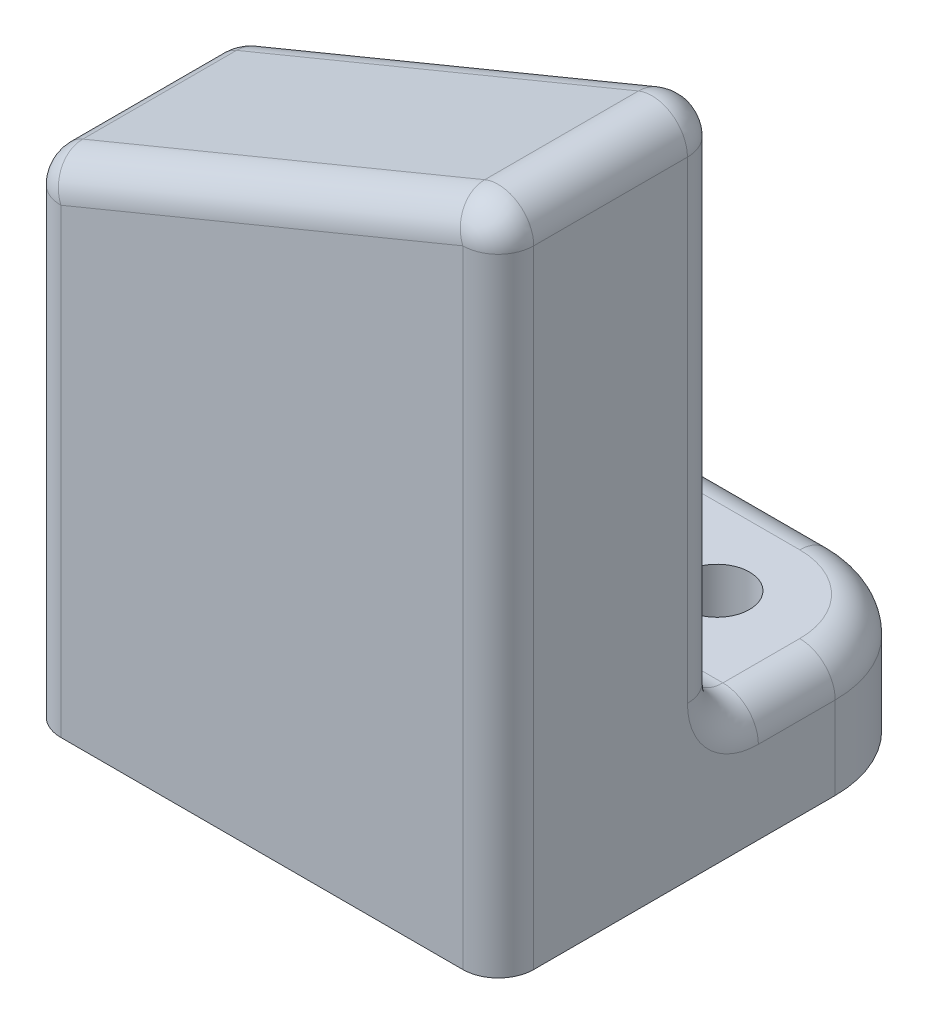
ISO-10303-21;
HEADER;
FILE_DESCRIPTION(('STEP AP214'),'2;1');
FILE_NAME('part.step','',(''),(''),'','','');
FILE_SCHEMA(('AUTOMOTIVE_DESIGN { 1 0 10303 214 1 1 1 1 }'));
ENDSEC;
DATA;
#1=APPLICATION_CONTEXT('core data for automotive mechanical design processes');
#2=APPLICATION_PROTOCOL_DEFINITION('international standard','automotive_design',2000,#1);
#3=PRODUCT_CONTEXT('',#1,'mechanical');
#4=PRODUCT('Part','Part','',(#3));
#5=PRODUCT_RELATED_PRODUCT_CATEGORY('part','',(#4));
#6=PRODUCT_DEFINITION_FORMATION('','',#4);
#7=PRODUCT_DEFINITION_CONTEXT('part definition',#1,'design');
#8=PRODUCT_DEFINITION('design','',#6,#7);
#9=PRODUCT_DEFINITION_SHAPE('','',#8);
#10=(LENGTH_UNIT() NAMED_UNIT(*) SI_UNIT(.MILLI.,.METRE.));
#11=(NAMED_UNIT(*) PLANE_ANGLE_UNIT() SI_UNIT($,.RADIAN.));
#12=(NAMED_UNIT(*) SI_UNIT($,.STERADIAN.) SOLID_ANGLE_UNIT());
#13=UNCERTAINTY_MEASURE_WITH_UNIT(LENGTH_MEASURE(1.E-05),#10,'distance_accuracy_value','');
#14=(GEOMETRIC_REPRESENTATION_CONTEXT(3) GLOBAL_UNCERTAINTY_ASSIGNED_CONTEXT((#13)) GLOBAL_UNIT_ASSIGNED_CONTEXT((#10,
#11,#12)) REPRESENTATION_CONTEXT('',''));
#15=CARTESIAN_POINT('',(0.,0.,0.));
#16=DIRECTION('',(0.,0.,1.));
#17=DIRECTION('',(1.,0.,0.));
#18=AXIS2_PLACEMENT_3D('',#15,#16,#17);
#19=CARTESIAN_POINT('',(20.,0.,-38.));
#20=DIRECTION('',(0.,1.,0.));
#21=DIRECTION('',(0.,0.,-1.));
#22=AXIS2_PLACEMENT_3D('',#19,#20,#21);
#23=PLANE('',#22);
#24=CARTESIAN_POINT('',(-10.,0.,-28.5));
#25=DIRECTION('',(0.,-1.,0.));
#26=DIRECTION('',(0.,0.,-1.));
#27=AXIS2_PLACEMENT_3D('',#24,#25,#26);
#28=CIRCLE('',#27,2.75);
#29=CARTESIAN_POINT('',(-10.,0.,-31.25));
#30=VERTEX_POINT('',#29);
#31=EDGE_CURVE('E683',#30,#30,#28,.T.);
#32=ORIENTED_EDGE('',*,*,#31,.F.);
#33=EDGE_LOOP('',(#32));
#34=FACE_BOUND('',#33,.T.);
#35=CARTESIAN_POINT('',(10.,0.,-28.5));
#36=DIRECTION('',(0.,-1.,0.));
#37=DIRECTION('',(0.,0.,-1.));
#38=AXIS2_PLACEMENT_3D('',#35,#36,#37);
#39=CIRCLE('',#38,2.75);
#40=CARTESIAN_POINT('',(10.,0.,-31.25));
#41=VERTEX_POINT('',#40);
#42=EDGE_CURVE('E338',#41,#41,#39,.T.);
#43=ORIENTED_EDGE('',*,*,#42,.F.);
#44=EDGE_LOOP('',(#43));
#45=FACE_BOUND('',#44,.T.);
#46=DIRECTION('',(0.,0.,1.));
#47=VECTOR('',#46,1.);
#48=CARTESIAN_POINT('',(-20.,0.,-38.));
#49=LINE('',#48,#47);
#50=CARTESIAN_POINT('',(-20.,0.,-28.5));
#51=VERTEX_POINT('',#50);
#52=CARTESIAN_POINT('',(-20.,0.,-3.));
#53=VERTEX_POINT('',#52);
#54=EDGE_CURVE('E197',#51,#53,#49,.T.);
#55=ORIENTED_EDGE('',*,*,#54,.F.);
#56=CARTESIAN_POINT('',(-10.5,0.,-28.5));
#57=DIRECTION('',(0.,-1.,0.));
#58=DIRECTION('',(0.,0.,-1.));
#59=AXIS2_PLACEMENT_3D('',#56,#57,#58);
#60=CIRCLE('',#59,9.5);
#61=CARTESIAN_POINT('',(-10.5,0.,-38.));
#62=VERTEX_POINT('',#61);
#63=EDGE_CURVE('E189',#62,#51,#60,.F.);
#64=ORIENTED_EDGE('',*,*,#63,.F.);
#65=DIRECTION('',(-1.,0.,0.));
#66=VECTOR('',#65,1.);
#67=CARTESIAN_POINT('',(20.,0.,-38.));
#68=LINE('',#67,#66);
#69=CARTESIAN_POINT('',(10.5,0.,-38.));
#70=VERTEX_POINT('',#69);
#71=EDGE_CURVE('E172',#70,#62,#68,.T.);
#72=ORIENTED_EDGE('',*,*,#71,.F.);
#73=CARTESIAN_POINT('',(10.5,0.,-28.5));
#74=DIRECTION('',(0.,-1.,0.));
#75=DIRECTION('',(0.,0.,-1.));
#76=AXIS2_PLACEMENT_3D('',#73,#74,#75);
#77=CIRCLE('',#76,9.5);
#78=CARTESIAN_POINT('',(20.,0.,-28.5));
#79=VERTEX_POINT('',#78);
#80=EDGE_CURVE('E182',#79,#70,#77,.F.);
#81=ORIENTED_EDGE('',*,*,#80,.F.);
#82=DIRECTION('',(0.,0.,1.));
#83=VECTOR('',#82,1.);
#84=CARTESIAN_POINT('',(20.,0.,-38.));
#85=LINE('',#84,#83);
#86=CARTESIAN_POINT('',(20.,0.,-3.));
#87=VERTEX_POINT('',#86);
#88=EDGE_CURVE('E193',#79,#87,#85,.T.);
#89=ORIENTED_EDGE('',*,*,#88,.T.);
#90=CARTESIAN_POINT('',(17.,0.,-3.));
#91=DIRECTION('',(0.,-1.,0.));
#92=DIRECTION('',(0.,0.,-1.));
#93=AXIS2_PLACEMENT_3D('',#90,#91,#92);
#94=CIRCLE('',#93,3.);
#95=CARTESIAN_POINT('',(17.,0.,0.));
#96=VERTEX_POINT('',#95);
#97=EDGE_CURVE('E48',#96,#87,#94,.F.);
#98=ORIENTED_EDGE('',*,*,#97,.F.);
#99=DIRECTION('',(-1.,0.,0.));
#100=VECTOR('',#99,1.);
#101=CARTESIAN_POINT('',(20.,0.,0.));
#102=LINE('',#101,#100);
#103=CARTESIAN_POINT('',(-17.,0.,0.));
#104=VERTEX_POINT('',#103);
#105=EDGE_CURVE('E179',#96,#104,#102,.T.);
#106=ORIENTED_EDGE('',*,*,#105,.T.);
#107=CARTESIAN_POINT('',(-17.,0.,-3.));
#108=DIRECTION('',(0.,-1.,0.));
#109=DIRECTION('',(0.,0.,-1.));
#110=AXIS2_PLACEMENT_3D('',#107,#108,#109);
#111=CIRCLE('',#110,3.);
#112=EDGE_CURVE('E11',#53,#104,#111,.F.);
#113=ORIENTED_EDGE('',*,*,#112,.F.);
#114=EDGE_LOOP('',(#55,#64,#72,#81,#89,#98,#106,#113));
#115=FACE_BOUND('',#114,.T.);
#116=ADVANCED_FACE('F39',(#34,#45,#115),#23,.F.);
#117=CARTESIAN_POINT('',(20.,0.,0.));
#118=DIRECTION('',(0.,0.,-1.));
#119=DIRECTION('',(0.,-1.,0.));
#120=AXIS2_PLACEMENT_3D('',#117,#118,#119);
#121=PLANE('',#120);
#122=ORIENTED_EDGE('',*,*,#105,.F.);
#123=DIRECTION('',(0.,1.,0.));
#124=VECTOR('',#123,1.);
#125=CARTESIAN_POINT('',(17.,0.,0.));
#126=LINE('',#125,#124);
#127=CARTESIAN_POINT('',(17.,53.01728718,0.));
#128=VERTEX_POINT('',#127);
#129=EDGE_CURVE('E301',#128,#96,#126,.F.);
#130=ORIENTED_EDGE('',*,*,#129,.F.);
#131=DIRECTION('',(-0.924438601097928,-0.381330922952895,0.));
#132=VECTOR('',#131,1.);
#133=CARTESIAN_POINT('',(0.874263832928299,46.3654210110829,0.));
#134=LINE('',#133,#132);
#135=CARTESIAN_POINT('',(-17.,38.99228718,0.));
#136=VERTEX_POINT('',#135);
#137=EDGE_CURVE('E303',#136,#128,#134,.F.);
#138=ORIENTED_EDGE('',*,*,#137,.F.);
#139=DIRECTION('',(0.,1.,0.));
#140=VECTOR('',#139,1.);
#141=CARTESIAN_POINT('',(-17.,0.,0.));
#142=LINE('',#141,#140);
#143=EDGE_CURVE('E306',#104,#136,#142,.T.);
#144=ORIENTED_EDGE('',*,*,#143,.F.);
#145=EDGE_LOOP('',(#122,#130,#138,#144));
#146=FACE_BOUND('',#145,.T.);
#147=ADVANCED_FACE('F348',(#146),#121,.F.);
#148=CARTESIAN_POINT('',(20.,60.,-19.));
#149=DIRECTION('',(0.,0.,1.));
#150=DIRECTION('',(0.,1.,0.));
#151=AXIS2_PLACEMENT_3D('',#148,#149,#150);
#152=PLANE('',#151);
#153=DIRECTION('',(0.924438601097928,0.381330922952895,0.));
#154=VECTOR('',#153,1.);
#155=CARTESIAN_POINT('',(22.0252853311257,55.0902173790893,-19.));
#156=LINE('',#155,#154);
#157=CARTESIAN_POINT('',(17.,53.01728718,-19.));
#158=VERTEX_POINT('',#157);
#159=CARTESIAN_POINT('',(-17.,38.99228718,-19.));
#160=VERTEX_POINT('',#159);
#161=EDGE_CURVE('E239',#158,#160,#156,.F.);
#162=ORIENTED_EDGE('',*,*,#161,.F.);
#163=DIRECTION('',(0.,-1.,0.));
#164=VECTOR('',#163,1.);
#165=CARTESIAN_POINT('',(17.,53.01728718,-19.));
#166=LINE('',#165,#164);
#167=CARTESIAN_POINT('',(17.,13.,-19.));
#168=VERTEX_POINT('',#167);
#169=EDGE_CURVE('E236',#168,#158,#166,.F.);
#170=ORIENTED_EDGE('',*,*,#169,.F.);
#171=DIRECTION('',(-1.,0.,0.));
#172=VECTOR('',#171,1.);
#173=CARTESIAN_POINT('',(20.,13.,-19.));
#174=LINE('',#173,#172);
#175=CARTESIAN_POINT('',(-17.,13.,-19.));
#176=VERTEX_POINT('',#175);
#177=EDGE_CURVE('E210',#176,#168,#174,.F.);
#178=ORIENTED_EDGE('',*,*,#177,.F.);
#179=DIRECTION('',(0.,-1.,0.));
#180=VECTOR('',#179,1.);
#181=CARTESIAN_POINT('',(-17.,60.,-19.));
#182=LINE('',#181,#180);
#183=EDGE_CURVE('E242',#160,#176,#182,.T.);
#184=ORIENTED_EDGE('',*,*,#183,.F.);
#185=EDGE_LOOP('',(#162,#170,#178,#184));
#186=FACE_BOUND('',#185,.T.);
#187=ADVANCED_FACE('F376',(#186),#152,.F.);
#188=CARTESIAN_POINT('',(20.,10.,-19.));
#189=DIRECTION('',(0.,-1.,0.));
#190=DIRECTION('',(0.,0.,1.));
#191=AXIS2_PLACEMENT_3D('',#188,#189,#190);
#192=PLANE('',#191);
#193=CARTESIAN_POINT('',(-10.,10.,-28.5));
#194=DIRECTION('',(0.,-1.,0.));
#195=DIRECTION('',(0.,0.,-1.));
#196=AXIS2_PLACEMENT_3D('',#193,#194,#195);
#197=CIRCLE('',#196,2.75);
#198=CARTESIAN_POINT('',(-10.,10.,-31.25));
#199=VERTEX_POINT('',#198);
#200=EDGE_CURVE('E686',#199,#199,#197,.T.);
#201=ORIENTED_EDGE('',*,*,#200,.T.);
#202=EDGE_LOOP('',(#201));
#203=FACE_BOUND('',#202,.T.);
#204=CARTESIAN_POINT('',(10.,10.,-28.5));
#205=DIRECTION('',(0.,-1.,0.));
#206=DIRECTION('',(0.,0.,-1.));
#207=AXIS2_PLACEMENT_3D('',#204,#205,#206);
#208=CIRCLE('',#207,2.75);
#209=CARTESIAN_POINT('',(10.,10.,-31.25));
#210=VERTEX_POINT('',#209);
#211=EDGE_CURVE('E688',#210,#210,#208,.T.);
#212=ORIENTED_EDGE('',*,*,#211,.T.);
#213=EDGE_LOOP('',(#212));
#214=FACE_BOUND('',#213,.T.);
#215=DIRECTION('',(-1.,0.,0.));
#216=VECTOR('',#215,1.);
#217=CARTESIAN_POINT('',(-20.,10.,-22.));
#218=LINE('',#217,#216);
#219=CARTESIAN_POINT('',(17.,10.,-22.));
#220=VERTEX_POINT('',#219);
#221=CARTESIAN_POINT('',(-17.,10.,-22.));
#222=VERTEX_POINT('',#221);
#223=EDGE_CURVE('E222',#220,#222,#218,.T.);
#224=ORIENTED_EDGE('',*,*,#223,.F.);
#225=DIRECTION('',(0.,0.,-1.));
#226=VECTOR('',#225,1.);
#227=CARTESIAN_POINT('',(17.,10.,-22.));
#228=LINE('',#227,#226);
#229=CARTESIAN_POINT('',(17.,10.,-28.5));
#230=VERTEX_POINT('',#229);
#231=EDGE_CURVE('E267',#230,#220,#228,.F.);
#232=ORIENTED_EDGE('',*,*,#231,.F.);
#233=CARTESIAN_POINT('',(10.5,10.,-28.5));
#234=DIRECTION('',(0.,1.,0.));
#235=DIRECTION('',(0.,0.,1.));
#236=AXIS2_PLACEMENT_3D('',#233,#234,#235);
#237=CIRCLE('',#236,6.5);
#238=CARTESIAN_POINT('',(10.5,10.,-35.));
#239=VERTEX_POINT('',#238);
#240=EDGE_CURVE('E270',#239,#230,#237,.F.);
#241=ORIENTED_EDGE('',*,*,#240,.F.);
#242=DIRECTION('',(-1.,0.,0.));
#243=VECTOR('',#242,1.);
#244=CARTESIAN_POINT('',(20.,10.,-35.));
#245=LINE('',#244,#243);
#246=CARTESIAN_POINT('',(-10.5,10.,-35.));
#247=VERTEX_POINT('',#246);
#248=EDGE_CURVE('E273',#247,#239,#245,.F.);
#249=ORIENTED_EDGE('',*,*,#248,.F.);
#250=CARTESIAN_POINT('',(-10.5,10.,-28.5));
#251=DIRECTION('',(0.,1.,0.));
#252=DIRECTION('',(0.,0.,1.));
#253=AXIS2_PLACEMENT_3D('',#250,#251,#252);
#254=CIRCLE('',#253,6.5);
#255=CARTESIAN_POINT('',(-17.,10.,-28.5));
#256=VERTEX_POINT('',#255);
#257=EDGE_CURVE('E276',#256,#247,#254,.F.);
#258=ORIENTED_EDGE('',*,*,#257,.F.);
#259=DIRECTION('',(0.,0.,-1.));
#260=VECTOR('',#259,1.);
#261=CARTESIAN_POINT('',(-17.,10.,-19.));
#262=LINE('',#261,#260);
#263=EDGE_CURVE('E279',#222,#256,#262,.T.);
#264=ORIENTED_EDGE('',*,*,#263,.F.);
#265=EDGE_LOOP('',(#224,#232,#241,#249,#258,#264));
#266=FACE_BOUND('',#265,.T.);
#267=ADVANCED_FACE('F487',(#203,#214,#266),#192,.F.);
#268=CARTESIAN_POINT('',(20.,10.,-38.));
#269=DIRECTION('',(0.,0.,1.));
#270=DIRECTION('',(-1.,0.,0.));
#271=AXIS2_PLACEMENT_3D('',#268,#269,#270);
#272=PLANE('',#271);
#273=DIRECTION('',(0.,-1.,0.));
#274=VECTOR('',#273,1.);
#275=CARTESIAN_POINT('',(10.5,10.,-38.));
#276=LINE('',#275,#274);
#277=CARTESIAN_POINT('',(10.5,7.,-38.));
#278=VERTEX_POINT('',#277);
#279=EDGE_CURVE('E167',#70,#278,#276,.F.);
#280=ORIENTED_EDGE('',*,*,#279,.F.);
#281=ORIENTED_EDGE('',*,*,#71,.T.);
#282=DIRECTION('',(0.,-1.,0.));
#283=VECTOR('',#282,1.);
#284=CARTESIAN_POINT('',(-10.5,10.,-38.));
#285=LINE('',#284,#283);
#286=CARTESIAN_POINT('',(-10.5,7.,-38.));
#287=VERTEX_POINT('',#286);
#288=EDGE_CURVE('E178',#287,#62,#285,.T.);
#289=ORIENTED_EDGE('',*,*,#288,.F.);
#290=DIRECTION('',(-1.,0.,0.));
#291=VECTOR('',#290,1.);
#292=CARTESIAN_POINT('',(20.,7.,-38.));
#293=LINE('',#292,#291);
#294=EDGE_CURVE('E175',#278,#287,#293,.T.);
#295=ORIENTED_EDGE('',*,*,#294,.F.);
#296=EDGE_LOOP('',(#280,#281,#289,#295));
#297=FACE_BOUND('',#296,.T.);
#298=ADVANCED_FACE('F169',(#297),#272,.F.);
#299=CARTESIAN_POINT('',(20.,0.,0.));
#300=DIRECTION('',(1.,0.,0.));
#301=DIRECTION('',(0.,0.,1.));
#302=AXIS2_PLACEMENT_3D('',#299,#300,#301);
#303=PLANE('',#302);
#304=CARTESIAN_POINT('',(20.,13.,-22.));
#305=DIRECTION('',(-1.,0.,0.));
#306=DIRECTION('',(0.,0.,1.));
#307=AXIS2_PLACEMENT_3D('',#304,#305,#306);
#308=CIRCLE('',#307,6.);
#309=CARTESIAN_POINT('',(20.,13.,-16.));
#310=VERTEX_POINT('',#309);
#311=CARTESIAN_POINT('',(20.,7.,-22.));
#312=VERTEX_POINT('',#311);
#313=EDGE_CURVE('E295',#310,#312,#308,.F.);
#314=ORIENTED_EDGE('',*,*,#313,.F.);
#315=DIRECTION('',(0.,-1.,0.));
#316=VECTOR('',#315,1.);
#317=CARTESIAN_POINT('',(20.,13.,-16.));
#318=LINE('',#317,#316);
#319=CARTESIAN_POINT('',(20.,53.01728718,-16.));
#320=VERTEX_POINT('',#319);
#321=EDGE_CURVE('E292',#320,#310,#318,.T.);
#322=ORIENTED_EDGE('',*,*,#321,.F.);
#323=DIRECTION('',(0.,0.,-1.));
#324=VECTOR('',#323,1.);
#325=CARTESIAN_POINT('',(20.,53.01728718,-19.));
#326=LINE('',#325,#324);
#327=CARTESIAN_POINT('',(20.,53.01728718,-3.));
#328=VERTEX_POINT('',#327);
#329=EDGE_CURVE('E207',#328,#320,#326,.T.);
#330=ORIENTED_EDGE('',*,*,#329,.F.);
#331=DIRECTION('',(0.,1.,0.));
#332=VECTOR('',#331,1.);
#333=CARTESIAN_POINT('',(20.,53.01728718,-3.));
#334=LINE('',#333,#332);
#335=EDGE_CURVE('E289',#87,#328,#334,.T.);
#336=ORIENTED_EDGE('',*,*,#335,.F.);
#337=ORIENTED_EDGE('',*,*,#88,.F.);
#338=DIRECTION('',(0.,-1.,0.));
#339=VECTOR('',#338,1.);
#340=CARTESIAN_POINT('',(20.,0.,-28.5));
#341=LINE('',#340,#339);
#342=CARTESIAN_POINT('',(20.,7.,-28.5));
#343=VERTEX_POINT('',#342);
#344=EDGE_CURVE('E185',#343,#79,#341,.T.);
#345=ORIENTED_EDGE('',*,*,#344,.F.);
#346=DIRECTION('',(0.,0.,-1.));
#347=VECTOR('',#346,1.);
#348=CARTESIAN_POINT('',(20.,7.,-28.5));
#349=LINE('',#348,#347);
#350=EDGE_CURVE('E298',#312,#343,#349,.T.);
#351=ORIENTED_EDGE('',*,*,#350,.F.);
#352=EDGE_LOOP('',(#314,#322,#330,#336,#337,#345,#351));
#353=FACE_BOUND('',#352,.T.);
#354=ADVANCED_FACE('F353',(#353),#303,.T.);
#355=CARTESIAN_POINT('',(-20.,0.,0.));
#356=DIRECTION('',(1.,0.,0.));
#357=DIRECTION('',(0.,0.,1.));
#358=AXIS2_PLACEMENT_3D('',#355,#356,#357);
#359=PLANE('',#358);
#360=CARTESIAN_POINT('',(-20.,13.,-22.));
#361=DIRECTION('',(-1.,0.,0.));
#362=DIRECTION('',(0.,0.,1.));
#363=AXIS2_PLACEMENT_3D('',#360,#361,#362);
#364=CIRCLE('',#363,6.);
#365=CARTESIAN_POINT('',(-20.,7.,-22.));
#366=VERTEX_POINT('',#365);
#367=CARTESIAN_POINT('',(-20.,13.,-16.));
#368=VERTEX_POINT('',#367);
#369=EDGE_CURVE('E255',#366,#368,#364,.T.);
#370=ORIENTED_EDGE('',*,*,#369,.F.);
#371=DIRECTION('',(0.,0.,-1.));
#372=VECTOR('',#371,1.);
#373=CARTESIAN_POINT('',(-20.,7.,0.));
#374=LINE('',#373,#372);
#375=CARTESIAN_POINT('',(-20.,7.,-28.5));
#376=VERTEX_POINT('',#375);
#377=EDGE_CURVE('E252',#376,#366,#374,.F.);
#378=ORIENTED_EDGE('',*,*,#377,.F.);
#379=DIRECTION('',(0.,-1.,0.));
#380=VECTOR('',#379,1.);
#381=CARTESIAN_POINT('',(-20.,0.,-28.5));
#382=LINE('',#381,#380);
#383=EDGE_CURVE('E203',#51,#376,#382,.F.);
#384=ORIENTED_EDGE('',*,*,#383,.F.);
#385=ORIENTED_EDGE('',*,*,#54,.T.);
#386=DIRECTION('',(0.,1.,0.));
#387=VECTOR('',#386,1.);
#388=CARTESIAN_POINT('',(-20.,0.,-3.));
#389=LINE('',#388,#387);
#390=CARTESIAN_POINT('',(-20.,38.99228718,-3.));
#391=VERTEX_POINT('',#390);
#392=EDGE_CURVE('E250',#391,#53,#389,.F.);
#393=ORIENTED_EDGE('',*,*,#392,.F.);
#394=DIRECTION('',(0.,0.,-1.));
#395=VECTOR('',#394,1.);
#396=CARTESIAN_POINT('',(-20.,38.99228718,0.));
#397=LINE('',#396,#395);
#398=CARTESIAN_POINT('',(-20.,38.99228718,-16.));
#399=VERTEX_POINT('',#398);
#400=EDGE_CURVE('E219',#399,#391,#397,.F.);
#401=ORIENTED_EDGE('',*,*,#400,.F.);
#402=DIRECTION('',(0.,-1.,0.));
#403=VECTOR('',#402,1.);
#404=CARTESIAN_POINT('',(-20.,0.,-16.));
#405=LINE('',#404,#403);
#406=EDGE_CURVE('E258',#368,#399,#405,.F.);
#407=ORIENTED_EDGE('',*,*,#406,.F.);
#408=EDGE_LOOP('',(#370,#378,#384,#385,#393,#401,#407));
#409=FACE_BOUND('',#408,.T.);
#410=ADVANCED_FACE('F462',(#409),#359,.F.);
#411=CARTESIAN_POINT('',(25.5130671135382,59.7741401847825,-38.001));
#412=DIRECTION('',(0.381330922952895,-0.924438601097928,0.));
#413=DIRECTION('',(0.924438601097928,0.381330922952895,0.));
#414=AXIS2_PLACEMENT_3D('',#411,#412,#413);
#415=PLANE('',#414);
#416=DIRECTION('',(0.,0.,-1.));
#417=VECTOR('',#416,1.);
#418=CARTESIAN_POINT('',(-18.1439927688587,41.7656029832938,-38.001));
#419=LINE('',#418,#417);
#420=CARTESIAN_POINT('',(-18.1439927688587,41.7656029832938,-3.));
#421=VERTEX_POINT('',#420);
#422=CARTESIAN_POINT('',(-18.1439927688587,41.7656029832938,-16.));
#423=VERTEX_POINT('',#422);
#424=EDGE_CURVE('E213',#421,#423,#419,.T.);
#425=ORIENTED_EDGE('',*,*,#424,.F.);
#426=DIRECTION('',(-0.924438601097928,-0.381330922952895,0.));
#427=VECTOR('',#426,1.);
#428=CARTESIAN_POINT('',(25.5130671135382,59.7741401847825,-3.));
#429=LINE('',#428,#427);
#430=CARTESIAN_POINT('',(15.8560072311413,55.7906029832938,-3.));
#431=VERTEX_POINT('',#430);
#432=EDGE_CURVE('E230',#431,#421,#429,.T.);
#433=ORIENTED_EDGE('',*,*,#432,.F.);
#434=DIRECTION('',(0.,0.,-1.));
#435=VECTOR('',#434,1.);
#436=CARTESIAN_POINT('',(15.8560072311413,55.7906029832938,0.));
#437=LINE('',#436,#435);
#438=CARTESIAN_POINT('',(15.8560072311413,55.7906029832938,-16.));
#439=VERTEX_POINT('',#438);
#440=EDGE_CURVE('E216',#439,#431,#437,.F.);
#441=ORIENTED_EDGE('',*,*,#440,.F.);
#442=DIRECTION('',(0.924438601097928,0.381330922952895,0.));
#443=VECTOR('',#442,1.);
#444=CARTESIAN_POINT('',(25.5130671135382,59.7741401847825,-16.));
#445=LINE('',#444,#443);
#446=EDGE_CURVE('E233',#423,#439,#445,.T.);
#447=ORIENTED_EDGE('',*,*,#446,.F.);
#448=EDGE_LOOP('',(#425,#433,#441,#447));
#449=FACE_BOUND('',#448,.T.);
#450=ADVANCED_FACE('F385',(#449),#415,.F.);
#451=CARTESIAN_POINT('',(-10.5,10.,-28.5));
#452=DIRECTION('',(0.,-1.,0.));
#453=DIRECTION('',(0.,0.,1.));
#454=AXIS2_PLACEMENT_3D('',#451,#452,#453);
#455=CYLINDRICAL_SURFACE('',#454,9.5);
#456=ORIENTED_EDGE('',*,*,#288,.T.);
#457=ORIENTED_EDGE('',*,*,#63,.T.);
#458=ORIENTED_EDGE('',*,*,#383,.T.);
#459=CARTESIAN_POINT('',(-10.5,7.,-28.5));
#460=DIRECTION('',(0.,1.,0.));
#461=DIRECTION('',(0.,0.,1.));
#462=AXIS2_PLACEMENT_3D('',#459,#460,#461);
#463=CIRCLE('',#462,9.5);
#464=EDGE_CURVE('E282',#287,#376,#463,.T.);
#465=ORIENTED_EDGE('',*,*,#464,.F.);
#466=EDGE_LOOP('',(#456,#457,#458,#465));
#467=FACE_BOUND('',#466,.T.);
#468=ADVANCED_FACE('F382',(#467),#455,.T.);
#469=CARTESIAN_POINT('',(10.5,0.,-28.5));
#470=DIRECTION('',(0.,1.,0.));
#471=DIRECTION('',(0.,0.,-1.));
#472=AXIS2_PLACEMENT_3D('',#469,#470,#471);
#473=CYLINDRICAL_SURFACE('',#472,9.5);
#474=ORIENTED_EDGE('',*,*,#344,.T.);
#475=ORIENTED_EDGE('',*,*,#80,.T.);
#476=ORIENTED_EDGE('',*,*,#279,.T.);
#477=CARTESIAN_POINT('',(10.5,7.,-28.5));
#478=DIRECTION('',(0.,1.,0.));
#479=DIRECTION('',(0.,0.,1.));
#480=AXIS2_PLACEMENT_3D('',#477,#478,#479);
#481=CIRCLE('',#480,9.5);
#482=EDGE_CURVE('E286',#343,#278,#481,.T.);
#483=ORIENTED_EDGE('',*,*,#482,.F.);
#484=EDGE_LOOP('',(#474,#475,#476,#483));
#485=FACE_BOUND('',#484,.T.);
#486=ADVANCED_FACE('F183',(#485),#473,.T.);
#487=CARTESIAN_POINT('',(17.,53.01728718,0.));
#488=DIRECTION('',(0.,0.,1.));
#489=DIRECTION('',(0.,1.,0.));
#490=AXIS2_PLACEMENT_3D('',#487,#488,#489);
#491=CYLINDRICAL_SURFACE('',#490,3.);
#492=ORIENTED_EDGE('',*,*,#440,.T.);
#493=CARTESIAN_POINT('',(17.,53.01728718,-3.));
#494=DIRECTION('',(0.,0.,-1.));
#495=DIRECTION('',(0.,1.,0.));
#496=AXIS2_PLACEMENT_3D('',#493,#494,#495);
#497=CIRCLE('',#496,3.);
#498=EDGE_CURVE('E225',#328,#431,#497,.F.);
#499=ORIENTED_EDGE('',*,*,#498,.F.);
#500=ORIENTED_EDGE('',*,*,#329,.T.);
#501=CARTESIAN_POINT('',(17.,53.01728718,-16.));
#502=DIRECTION('',(0.,0.,-1.));
#503=DIRECTION('',(0.,1.,0.));
#504=AXIS2_PLACEMENT_3D('',#501,#502,#503);
#505=CIRCLE('',#504,3.);
#506=EDGE_CURVE('E227',#439,#320,#505,.T.);
#507=ORIENTED_EDGE('',*,*,#506,.F.);
#508=EDGE_LOOP('',(#492,#499,#500,#507));
#509=FACE_BOUND('',#508,.T.);
#510=ADVANCED_FACE('F358',(#509),#491,.T.);
#511=CARTESIAN_POINT('',(-17.,38.99228718,-38.001));
#512=DIRECTION('',(0.,0.,-1.));
#513=DIRECTION('',(0.,-1.,0.));
#514=AXIS2_PLACEMENT_3D('',#511,#512,#513);
#515=CYLINDRICAL_SURFACE('',#514,3.);
#516=ORIENTED_EDGE('',*,*,#400,.T.);
#517=CARTESIAN_POINT('',(-17.,38.99228718,-3.));
#518=DIRECTION('',(0.,0.,1.));
#519=DIRECTION('',(0.,-1.,0.));
#520=AXIS2_PLACEMENT_3D('',#517,#518,#519);
#521=CIRCLE('',#520,3.);
#522=EDGE_CURVE('E245',#421,#391,#521,.T.);
#523=ORIENTED_EDGE('',*,*,#522,.F.);
#524=ORIENTED_EDGE('',*,*,#424,.T.);
#525=CARTESIAN_POINT('',(-17.,38.99228718,-16.));
#526=DIRECTION('',(0.,0.,1.));
#527=DIRECTION('',(0.,-1.,0.));
#528=AXIS2_PLACEMENT_3D('',#525,#526,#527);
#529=CIRCLE('',#528,3.);
#530=EDGE_CURVE('E247',#399,#423,#529,.F.);
#531=ORIENTED_EDGE('',*,*,#530,.F.);
#532=EDGE_LOOP('',(#516,#523,#524,#531));
#533=FACE_BOUND('',#532,.T.);
#534=ADVANCED_FACE('F391',(#533),#515,.T.);
#535=CARTESIAN_POINT('',(20.,13.,-22.));
#536=DIRECTION('',(1.,0.,0.));
#537=DIRECTION('',(0.,0.,1.));
#538=AXIS2_PLACEMENT_3D('',#535,#536,#537);
#539=CYLINDRICAL_SURFACE('',#538,3.);
#540=ORIENTED_EDGE('',*,*,#177,.T.);
#541=CARTESIAN_POINT('',(17.,13.,-22.));
#542=DIRECTION('',(-1.,0.,0.));
#543=DIRECTION('',(0.,0.,1.));
#544=AXIS2_PLACEMENT_3D('',#541,#542,#543);
#545=CIRCLE('',#544,3.);
#546=EDGE_CURVE('E261',#220,#168,#545,.T.);
#547=ORIENTED_EDGE('',*,*,#546,.F.);
#548=ORIENTED_EDGE('',*,*,#223,.T.);
#549=CARTESIAN_POINT('',(-17.,13.,-22.));
#550=DIRECTION('',(-1.,0.,0.));
#551=DIRECTION('',(0.,0.,1.));
#552=AXIS2_PLACEMENT_3D('',#549,#550,#551);
#553=CIRCLE('',#552,3.);
#554=EDGE_CURVE('E264',#176,#222,#553,.F.);
#555=ORIENTED_EDGE('',*,*,#554,.F.);
#556=EDGE_LOOP('',(#540,#547,#548,#555));
#557=FACE_BOUND('',#556,.T.);
#558=ADVANCED_FACE('F394',(#557),#539,.F.);
#559=CARTESIAN_POINT('',(-10.5,7.,-28.5));
#560=DIRECTION('',(0.,-1.,0.));
#561=DIRECTION('',(0.,0.,1.));
#562=AXIS2_PLACEMENT_3D('',#559,#560,#561);
#563=TOROIDAL_SURFACE('',#562,6.5,3.);
#564=CARTESIAN_POINT('',(-17.,7.,-28.5));
#565=DIRECTION('',(0.,0.,-1.));
#566=DIRECTION('',(-1.,0.,0.));
#567=AXIS2_PLACEMENT_3D('',#564,#565,#566);
#568=CIRCLE('',#567,3.);
#569=EDGE_CURVE('E332',#376,#256,#568,.T.);
#570=ORIENTED_EDGE('',*,*,#569,.T.);
#571=ORIENTED_EDGE('',*,*,#257,.T.);
#572=CARTESIAN_POINT('',(-10.5,7.,-35.));
#573=DIRECTION('',(-1.,0.,0.));
#574=DIRECTION('',(0.,0.,1.));
#575=AXIS2_PLACEMENT_3D('',#572,#573,#574);
#576=CIRCLE('',#575,3.);
#577=EDGE_CURVE('E334',#247,#287,#576,.T.);
#578=ORIENTED_EDGE('',*,*,#577,.T.);
#579=ORIENTED_EDGE('',*,*,#464,.T.);
#580=EDGE_LOOP('',(#570,#571,#578,#579));
#581=FACE_BOUND('',#580,.T.);
#582=ADVANCED_FACE('F398',(#581),#563,.T.);
#583=CARTESIAN_POINT('',(20.,7.,-35.));
#584=DIRECTION('',(-1.,0.,0.));
#585=DIRECTION('',(0.,0.,-1.));
#586=AXIS2_PLACEMENT_3D('',#583,#584,#585);
#587=CYLINDRICAL_SURFACE('',#586,3.);
#588=ORIENTED_EDGE('',*,*,#577,.F.);
#589=ORIENTED_EDGE('',*,*,#248,.T.);
#590=CARTESIAN_POINT('',(10.5,7.,-35.));
#591=DIRECTION('',(-1.,0.,0.));
#592=DIRECTION('',(0.,0.,1.));
#593=AXIS2_PLACEMENT_3D('',#590,#591,#592);
#594=CIRCLE('',#593,3.);
#595=EDGE_CURVE('E330',#239,#278,#594,.T.);
#596=ORIENTED_EDGE('',*,*,#595,.T.);
#597=ORIENTED_EDGE('',*,*,#294,.T.);
#598=EDGE_LOOP('',(#588,#589,#596,#597));
#599=FACE_BOUND('',#598,.T.);
#600=ADVANCED_FACE('F438',(#599),#587,.T.);
#601=CARTESIAN_POINT('',(-17.,7.,-19.));
#602=DIRECTION('',(0.,0.,-1.));
#603=DIRECTION('',(0.,-1.,0.));
#604=AXIS2_PLACEMENT_3D('',#601,#602,#603);
#605=CYLINDRICAL_SURFACE('',#604,3.);
#606=ORIENTED_EDGE('',*,*,#569,.F.);
#607=ORIENTED_EDGE('',*,*,#377,.T.);
#608=CARTESIAN_POINT('',(-17.,7.,-22.));
#609=DIRECTION('',(0.,0.,-1.));
#610=DIRECTION('',(-1.,0.,0.));
#611=AXIS2_PLACEMENT_3D('',#608,#609,#610);
#612=CIRCLE('',#611,3.);
#613=EDGE_CURVE('E328',#366,#222,#612,.T.);
#614=ORIENTED_EDGE('',*,*,#613,.T.);
#615=ORIENTED_EDGE('',*,*,#263,.T.);
#616=EDGE_LOOP('',(#606,#607,#614,#615));
#617=FACE_BOUND('',#616,.T.);
#618=ADVANCED_FACE('F434',(#617),#605,.T.);
#619=CARTESIAN_POINT('',(10.5,7.,-28.5));
#620=DIRECTION('',(0.,-1.,0.));
#621=DIRECTION('',(0.,0.,1.));
#622=AXIS2_PLACEMENT_3D('',#619,#620,#621);
#623=TOROIDAL_SURFACE('',#622,6.5,3.);
#624=ORIENTED_EDGE('',*,*,#595,.F.);
#625=ORIENTED_EDGE('',*,*,#240,.T.);
#626=CARTESIAN_POINT('',(17.,7.,-28.5));
#627=DIRECTION('',(0.,0.,-1.));
#628=DIRECTION('',(-1.,0.,0.));
#629=AXIS2_PLACEMENT_3D('',#626,#627,#628);
#630=CIRCLE('',#629,3.);
#631=EDGE_CURVE('E326',#230,#343,#630,.T.);
#632=ORIENTED_EDGE('',*,*,#631,.T.);
#633=ORIENTED_EDGE('',*,*,#482,.T.);
#634=EDGE_LOOP('',(#624,#625,#632,#633));
#635=FACE_BOUND('',#634,.T.);
#636=ADVANCED_FACE('F430',(#635),#623,.T.);
#637=CARTESIAN_POINT('',(-17.,13.,-22.));
#638=DIRECTION('',(1.,0.,0.));
#639=DIRECTION('',(0.,0.,1.));
#640=AXIS2_PLACEMENT_3D('',#637,#638,#639);
#641=TOROIDAL_SURFACE('',#640,6.,3.);
#642=ORIENTED_EDGE('',*,*,#613,.F.);
#643=ORIENTED_EDGE('',*,*,#369,.T.);
#644=CARTESIAN_POINT('',(-17.,13.,-16.));
#645=DIRECTION('',(0.,-1.,0.));
#646=DIRECTION('',(0.,0.,-1.));
#647=AXIS2_PLACEMENT_3D('',#644,#645,#646);
#648=CIRCLE('',#647,3.);
#649=EDGE_CURVE('E324',#368,#176,#648,.T.);
#650=ORIENTED_EDGE('',*,*,#649,.T.);
#651=ORIENTED_EDGE('',*,*,#554,.T.);
#652=EDGE_LOOP('',(#642,#643,#650,#651));
#653=FACE_BOUND('',#652,.T.);
#654=ADVANCED_FACE('F426',(#653),#641,.T.);
#655=CARTESIAN_POINT('',(17.,7.,0.));
#656=DIRECTION('',(0.,0.,1.));
#657=DIRECTION('',(0.,1.,0.));
#658=AXIS2_PLACEMENT_3D('',#655,#656,#657);
#659=CYLINDRICAL_SURFACE('',#658,3.);
#660=ORIENTED_EDGE('',*,*,#631,.F.);
#661=ORIENTED_EDGE('',*,*,#231,.T.);
#662=CARTESIAN_POINT('',(17.,7.,-22.));
#663=DIRECTION('',(0.,0.,-1.));
#664=DIRECTION('',(-1.,0.,0.));
#665=AXIS2_PLACEMENT_3D('',#662,#663,#664);
#666=CIRCLE('',#665,3.);
#667=EDGE_CURVE('E322',#220,#312,#666,.T.);
#668=ORIENTED_EDGE('',*,*,#667,.T.);
#669=ORIENTED_EDGE('',*,*,#350,.T.);
#670=EDGE_LOOP('',(#660,#661,#668,#669));
#671=FACE_BOUND('',#670,.T.);
#672=ADVANCED_FACE('F422',(#671),#659,.T.);
#673=CARTESIAN_POINT('',(-17.,60.,-16.));
#674=DIRECTION('',(0.,-1.,0.));
#675=DIRECTION('',(0.,0.,1.));
#676=AXIS2_PLACEMENT_3D('',#673,#674,#675);
#677=CYLINDRICAL_SURFACE('',#676,3.);
#678=ORIENTED_EDGE('',*,*,#649,.F.);
#679=ORIENTED_EDGE('',*,*,#406,.T.);
#680=CARTESIAN_POINT('',(-17.,38.99228718,-16.));
#681=DIRECTION('',(0.,-1.,0.));
#682=DIRECTION('',(0.,0.,-1.));
#683=AXIS2_PLACEMENT_3D('',#680,#681,#682);
#684=CIRCLE('',#683,3.);
#685=EDGE_CURVE('E319',#399,#160,#684,.T.);
#686=ORIENTED_EDGE('',*,*,#685,.T.);
#687=ORIENTED_EDGE('',*,*,#183,.T.);
#688=EDGE_LOOP('',(#678,#679,#686,#687));
#689=FACE_BOUND('',#688,.T.);
#690=ADVANCED_FACE('F418',(#689),#677,.T.);
#691=CARTESIAN_POINT('',(17.,13.,-22.));
#692=DIRECTION('',(1.,0.,0.));
#693=DIRECTION('',(0.,0.,1.));
#694=AXIS2_PLACEMENT_3D('',#691,#692,#693);
#695=TOROIDAL_SURFACE('',#694,6.,3.);
#696=ORIENTED_EDGE('',*,*,#667,.F.);
#697=ORIENTED_EDGE('',*,*,#546,.T.);
#698=CARTESIAN_POINT('',(17.,13.,-16.));
#699=DIRECTION('',(0.,-1.,0.));
#700=DIRECTION('',(0.,0.,-1.));
#701=AXIS2_PLACEMENT_3D('',#698,#699,#700);
#702=CIRCLE('',#701,3.);
#703=EDGE_CURVE('E317',#168,#310,#702,.T.);
#704=ORIENTED_EDGE('',*,*,#703,.T.);
#705=ORIENTED_EDGE('',*,*,#313,.T.);
#706=EDGE_LOOP('',(#696,#697,#704,#705));
#707=FACE_BOUND('',#706,.T.);
#708=ADVANCED_FACE('F414',(#707),#695,.T.);
#709=CARTESIAN_POINT('',(-17.,38.99228718,-16.));
#710=DIRECTION('',(0.,0.,1.));
#711=DIRECTION('',(0.,1.,0.));
#712=AXIS2_PLACEMENT_3D('',#709,#710,#711);
#713=SPHERICAL_SURFACE('',#712,3.);
#714=ORIENTED_EDGE('',*,*,#530,.T.);
#715=CARTESIAN_POINT('',(-17.,38.99228718,-16.));
#716=DIRECTION('',(-0.924438601097928,-0.381330922952895,0.));
#717=DIRECTION('',(-0.381330922952895,0.924438601097928,0.));
#718=AXIS2_PLACEMENT_3D('',#715,#716,#717);
#719=CIRCLE('',#718,3.);
#720=EDGE_CURVE('E315',#423,#160,#719,.T.);
#721=ORIENTED_EDGE('',*,*,#720,.T.);
#722=ORIENTED_EDGE('',*,*,#685,.F.);
#723=EDGE_LOOP('',(#714,#721,#722));
#724=FACE_BOUND('',#723,.T.);
#725=ADVANCED_FACE('F410',(#724),#713,.T.);
#726=CARTESIAN_POINT('',(17.,0.,-16.));
#727=DIRECTION('',(0.,1.,0.));
#728=DIRECTION('',(0.,0.,-1.));
#729=AXIS2_PLACEMENT_3D('',#726,#727,#728);
#730=CYLINDRICAL_SURFACE('',#729,3.);
#731=ORIENTED_EDGE('',*,*,#703,.F.);
#732=ORIENTED_EDGE('',*,*,#169,.T.);
#733=CARTESIAN_POINT('',(17.,53.01728718,-16.));
#734=DIRECTION('',(0.,-1.,0.));
#735=DIRECTION('',(0.,0.,-1.));
#736=AXIS2_PLACEMENT_3D('',#733,#734,#735);
#737=CIRCLE('',#736,3.);
#738=EDGE_CURVE('E313',#158,#320,#737,.T.);
#739=ORIENTED_EDGE('',*,*,#738,.T.);
#740=ORIENTED_EDGE('',*,*,#321,.T.);
#741=EDGE_LOOP('',(#731,#732,#739,#740));
#742=FACE_BOUND('',#741,.T.);
#743=ADVANCED_FACE('F406',(#742),#730,.T.);
#744=CARTESIAN_POINT('',(26.6570598823969,57.0008243814887,-16.));
#745=DIRECTION('',(0.924438601097928,0.381330922952895,0.));
#746=DIRECTION('',(-0.381330922952895,0.924438601097928,0.));
#747=AXIS2_PLACEMENT_3D('',#744,#745,#746);
#748=CYLINDRICAL_SURFACE('',#747,3.);
#749=ORIENTED_EDGE('',*,*,#720,.F.);
#750=ORIENTED_EDGE('',*,*,#446,.T.);
#751=CARTESIAN_POINT('',(17.,53.01728718,-16.));
#752=DIRECTION('',(-0.924438601097928,-0.381330922952895,0.));
#753=DIRECTION('',(-0.381330922952895,0.924438601097928,0.));
#754=AXIS2_PLACEMENT_3D('',#751,#752,#753);
#755=CIRCLE('',#754,3.);
#756=EDGE_CURVE('E311',#439,#158,#755,.T.);
#757=ORIENTED_EDGE('',*,*,#756,.T.);
#758=ORIENTED_EDGE('',*,*,#161,.T.);
#759=EDGE_LOOP('',(#749,#750,#757,#758));
#760=FACE_BOUND('',#759,.T.);
#761=ADVANCED_FACE('F402',(#760),#748,.T.);
#762=CARTESIAN_POINT('',(17.,53.01728718,-16.));
#763=DIRECTION('',(0.,0.,1.));
#764=DIRECTION('',(0.,1.,0.));
#765=AXIS2_PLACEMENT_3D('',#762,#763,#764);
#766=SPHERICAL_SURFACE('',#765,3.);
#767=ORIENTED_EDGE('',*,*,#738,.F.);
#768=ORIENTED_EDGE('',*,*,#756,.F.);
#769=ORIENTED_EDGE('',*,*,#506,.T.);
#770=EDGE_LOOP('',(#767,#768,#769));
#771=FACE_BOUND('',#770,.T.);
#772=ADVANCED_FACE('F369',(#771),#766,.T.);
#773=CARTESIAN_POINT('',(17.,0.,-3.));
#774=DIRECTION('',(0.,-1.,0.));
#775=DIRECTION('',(0.,0.,1.));
#776=AXIS2_PLACEMENT_3D('',#773,#774,#775);
#777=CYLINDRICAL_SURFACE('',#776,3.);
#778=CARTESIAN_POINT('',(17.,53.01728718,-3.));
#779=DIRECTION('',(0.,-1.,0.));
#780=DIRECTION('',(0.,0.,-1.));
#781=AXIS2_PLACEMENT_3D('',#778,#779,#780);
#782=CIRCLE('',#781,3.);
#783=EDGE_CURVE('E43',#328,#128,#782,.T.);
#784=ORIENTED_EDGE('',*,*,#783,.T.);
#785=ORIENTED_EDGE('',*,*,#129,.T.);
#786=ORIENTED_EDGE('',*,*,#97,.T.);
#787=ORIENTED_EDGE('',*,*,#335,.T.);
#788=EDGE_LOOP('',(#784,#785,#786,#787));
#789=FACE_BOUND('',#788,.T.);
#790=ADVANCED_FACE('F41',(#789),#777,.T.);
#791=CARTESIAN_POINT('',(17.,53.01728718,-3.));
#792=DIRECTION('',(0.,0.,-1.));
#793=DIRECTION('',(0.,-1.,0.));
#794=AXIS2_PLACEMENT_3D('',#791,#792,#793);
#795=SPHERICAL_SURFACE('',#794,3.);
#796=ORIENTED_EDGE('',*,*,#498,.T.);
#797=CARTESIAN_POINT('',(17.,53.01728718,-3.));
#798=DIRECTION('',(0.924438601097928,0.381330922952895,0.));
#799=DIRECTION('',(0.381330922952895,-0.924438601097928,0.));
#800=AXIS2_PLACEMENT_3D('',#797,#798,#799);
#801=CIRCLE('',#800,3.);
#802=EDGE_CURVE('E64',#431,#128,#801,.T.);
#803=ORIENTED_EDGE('',*,*,#802,.T.);
#804=ORIENTED_EDGE('',*,*,#783,.F.);
#805=EDGE_LOOP('',(#796,#803,#804));
#806=FACE_BOUND('',#805,.T.);
#807=ADVANCED_FACE('F361',(#806),#795,.T.);
#808=CARTESIAN_POINT('',(26.6570598823969,57.0008243814887,-3.));
#809=DIRECTION('',(-0.924438601097928,-0.381330922952895,0.));
#810=DIRECTION('',(0.381330922952895,-0.924438601097928,0.));
#811=AXIS2_PLACEMENT_3D('',#808,#809,#810);
#812=CYLINDRICAL_SURFACE('',#811,3.);
#813=CARTESIAN_POINT('',(-17.,38.99228718,-3.));
#814=DIRECTION('',(0.924438601097928,0.381330922952895,0.));
#815=DIRECTION('',(0.381330922952895,-0.924438601097928,0.));
#816=AXIS2_PLACEMENT_3D('',#813,#814,#815);
#817=CIRCLE('',#816,3.);
#818=EDGE_CURVE('E337',#421,#136,#817,.T.);
#819=ORIENTED_EDGE('',*,*,#818,.T.);
#820=ORIENTED_EDGE('',*,*,#137,.T.);
#821=ORIENTED_EDGE('',*,*,#802,.F.);
#822=ORIENTED_EDGE('',*,*,#432,.T.);
#823=EDGE_LOOP('',(#819,#820,#821,#822));
#824=FACE_BOUND('',#823,.T.);
#825=ADVANCED_FACE('F346',(#824),#812,.T.);
#826=CARTESIAN_POINT('',(-17.,38.99228718,-3.));
#827=DIRECTION('',(0.,0.,-1.));
#828=DIRECTION('',(0.,-1.,0.));
#829=AXIS2_PLACEMENT_3D('',#826,#827,#828);
#830=SPHERICAL_SURFACE('',#829,3.);
#831=ORIENTED_EDGE('',*,*,#522,.T.);
#832=CARTESIAN_POINT('',(-17.,38.99228718,-3.));
#833=DIRECTION('',(0.,1.,0.));
#834=DIRECTION('',(0.,0.,1.));
#835=AXIS2_PLACEMENT_3D('',#832,#833,#834);
#836=CIRCLE('',#835,3.);
#837=EDGE_CURVE('E56',#391,#136,#836,.T.);
#838=ORIENTED_EDGE('',*,*,#837,.T.);
#839=ORIENTED_EDGE('',*,*,#818,.F.);
#840=EDGE_LOOP('',(#831,#838,#839));
#841=FACE_BOUND('',#840,.T.);
#842=ADVANCED_FACE('F367',(#841),#830,.T.);
#843=CARTESIAN_POINT('',(-17.,0.,-3.));
#844=DIRECTION('',(0.,1.,0.));
#845=DIRECTION('',(0.,0.,-1.));
#846=AXIS2_PLACEMENT_3D('',#843,#844,#845);
#847=CYLINDRICAL_SURFACE('',#846,3.);
#848=ORIENTED_EDGE('',*,*,#112,.T.);
#849=ORIENTED_EDGE('',*,*,#143,.T.);
#850=ORIENTED_EDGE('',*,*,#837,.F.);
#851=ORIENTED_EDGE('',*,*,#392,.T.);
#852=EDGE_LOOP('',(#848,#849,#850,#851));
#853=FACE_BOUND('',#852,.T.);
#854=ADVANCED_FACE('F446',(#853),#847,.T.);
#855=CARTESIAN_POINT('',(10.,10.,-28.5));
#856=DIRECTION('',(0.,1.,0.));
#857=DIRECTION('',(0.,0.,-1.));
#858=AXIS2_PLACEMENT_3D('',#855,#856,#857);
#859=CYLINDRICAL_SURFACE('',#858,2.75);
#860=ORIENTED_EDGE('',*,*,#42,.T.);
#861=EDGE_LOOP('',(#860));
#862=FACE_BOUND('',#861,.T.);
#863=ORIENTED_EDGE('',*,*,#211,.F.);
#864=EDGE_LOOP('',(#863));
#865=FACE_BOUND('',#864,.T.);
#866=ADVANCED_FACE('F449',(#862,#865),#859,.F.);
#867=CARTESIAN_POINT('',(-10.,10.,-28.5));
#868=DIRECTION('',(0.,1.,0.));
#869=DIRECTION('',(0.,0.,-1.));
#870=AXIS2_PLACEMENT_3D('',#867,#868,#869);
#871=CYLINDRICAL_SURFACE('',#870,2.75);
#872=ORIENTED_EDGE('',*,*,#31,.T.);
#873=EDGE_LOOP('',(#872));
#874=FACE_BOUND('',#873,.T.);
#875=ORIENTED_EDGE('',*,*,#200,.F.);
#876=EDGE_LOOP('',(#875));
#877=FACE_BOUND('',#876,.T.);
#878=ADVANCED_FACE('F669',(#874,#877),#871,.F.);
#879=CLOSED_SHELL('',(#116,#147,#187,#267,#298,#354,#410,#450,#468,#486,#510,#534,#558,#582,
#600,#618,#636,#654,#672,#690,#708,#725,#743,#761,#772,#790,#807,#825,#842,#854,#866,#878));
#880=MANIFOLD_SOLID_BREP('B2',#879);
#881=ADVANCED_BREP_SHAPE_REPRESENTATION('',(#18,#880),#14);
#882=SHAPE_DEFINITION_REPRESENTATION(#9,#881);
ENDSEC;
END-ISO-10303-21;
